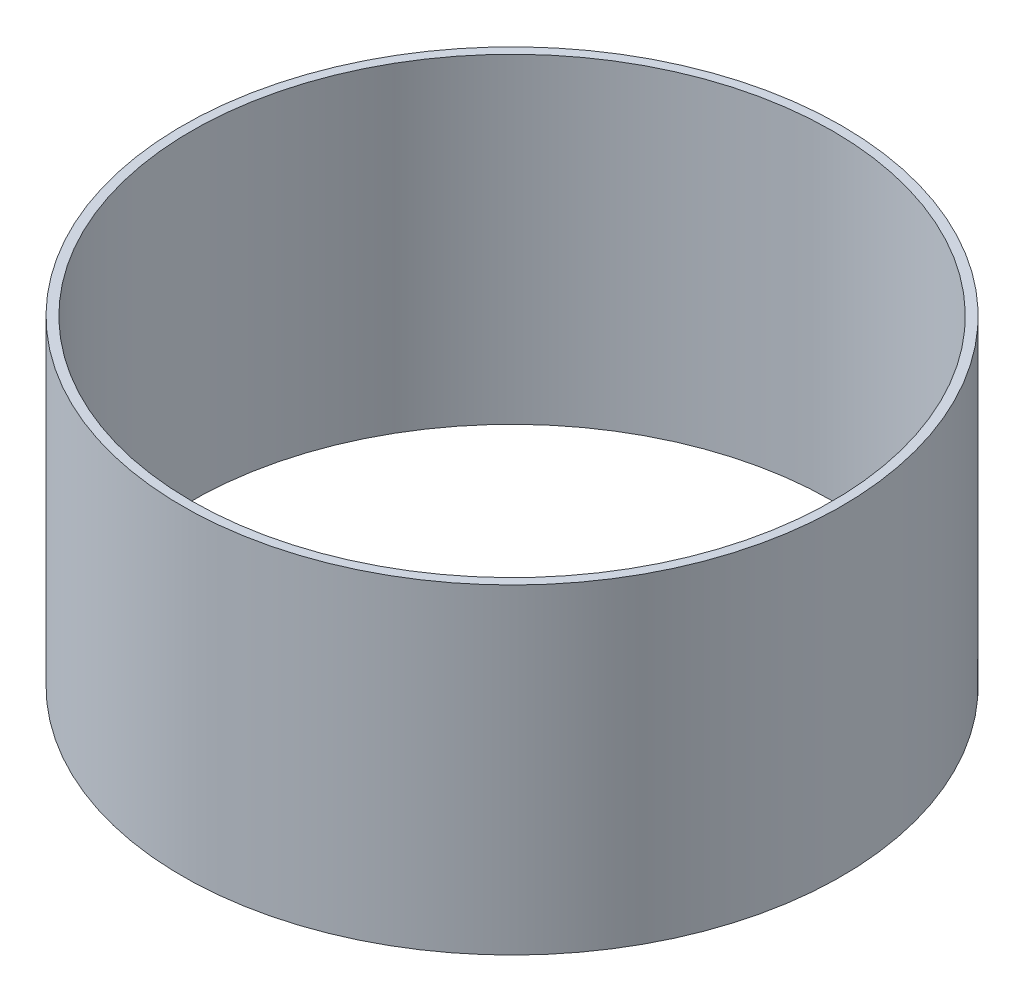
ISO-10303-21;
HEADER;
FILE_DESCRIPTION(('STEP AP214'),'2;1');
FILE_NAME('part.step','',(''),(''),'','','');
FILE_SCHEMA(('AUTOMOTIVE_DESIGN { 1 0 10303 214 1 1 1 1 }'));
ENDSEC;
DATA;
#1=APPLICATION_CONTEXT('core data for automotive mechanical design processes');
#2=APPLICATION_PROTOCOL_DEFINITION('international standard','automotive_design',2000,#1);
#3=PRODUCT_CONTEXT('',#1,'mechanical');
#4=PRODUCT('Part','Part','',(#3));
#5=PRODUCT_RELATED_PRODUCT_CATEGORY('part','',(#4));
#6=PRODUCT_DEFINITION_FORMATION('','',#4);
#7=PRODUCT_DEFINITION_CONTEXT('part definition',#1,'design');
#8=PRODUCT_DEFINITION('design','',#6,#7);
#9=PRODUCT_DEFINITION_SHAPE('','',#8);
#10=(LENGTH_UNIT() NAMED_UNIT(*) SI_UNIT(.MILLI.,.METRE.));
#11=(NAMED_UNIT(*) PLANE_ANGLE_UNIT() SI_UNIT($,.RADIAN.));
#12=(NAMED_UNIT(*) SI_UNIT($,.STERADIAN.) SOLID_ANGLE_UNIT());
#13=UNCERTAINTY_MEASURE_WITH_UNIT(LENGTH_MEASURE(1.E-05),#10,'distance_accuracy_value','');
#14=(GEOMETRIC_REPRESENTATION_CONTEXT(3) GLOBAL_UNCERTAINTY_ASSIGNED_CONTEXT((#13)) GLOBAL_UNIT_ASSIGNED_CONTEXT((#10,
#11,#12)) REPRESENTATION_CONTEXT('',''));
#15=CARTESIAN_POINT('',(0.,0.,0.));
#16=DIRECTION('',(0.,0.,1.));
#17=DIRECTION('',(1.,0.,0.));
#18=AXIS2_PLACEMENT_3D('',#15,#16,#17);
#19=CARTESIAN_POINT('',(0.,76.2,0.));
#20=DIRECTION('',(0.,1.,0.));
#21=DIRECTION('',(0.,0.,1.));
#22=AXIS2_PLACEMENT_3D('',#19,#20,#21);
#23=PLANE('',#22);
#24=CARTESIAN_POINT('',(0.,76.2,0.));
#25=DIRECTION('',(0.,1.,0.));
#26=DIRECTION('',(0.,0.,1.));
#27=AXIS2_PLACEMENT_3D('',#24,#25,#26);
#28=CIRCLE('',#27,78.359);
#29=CARTESIAN_POINT('',(0.,76.2,-78.359));
#30=VERTEX_POINT('',#29);
#31=EDGE_CURVE('E10',#30,#30,#28,.T.);
#32=ORIENTED_EDGE('',*,*,#31,.T.);
#33=EDGE_LOOP('',(#32));
#34=FACE_BOUND('',#33,.T.);
#35=CARTESIAN_POINT('',(0.,76.2,0.));
#36=DIRECTION('',(0.,1.,0.));
#37=DIRECTION('',(0.,0.,1.));
#38=AXIS2_PLACEMENT_3D('',#35,#36,#37);
#39=CIRCLE('',#38,76.2);
#40=CARTESIAN_POINT('',(0.,76.2,-76.2));
#41=VERTEX_POINT('',#40);
#42=EDGE_CURVE('E50',#41,#41,#39,.T.);
#43=ORIENTED_EDGE('',*,*,#42,.F.);
#44=EDGE_LOOP('',(#43));
#45=FACE_BOUND('',#44,.T.);
#46=ADVANCED_FACE('F37',(#34,#45),#23,.T.);
#47=CARTESIAN_POINT('',(0.,0.,0.));
#48=DIRECTION('',(0.,1.,0.));
#49=DIRECTION('',(0.,0.,1.));
#50=AXIS2_PLACEMENT_3D('',#47,#48,#49);
#51=PLANE('',#50);
#52=CARTESIAN_POINT('',(0.,0.,0.));
#53=DIRECTION('',(0.,1.,0.));
#54=DIRECTION('',(0.,0.,1.));
#55=AXIS2_PLACEMENT_3D('',#52,#53,#54);
#56=CIRCLE('',#55,78.359);
#57=CARTESIAN_POINT('',(0.,0.,-78.359));
#58=VERTEX_POINT('',#57);
#59=EDGE_CURVE('E41',#58,#58,#56,.T.);
#60=ORIENTED_EDGE('',*,*,#59,.F.);
#61=EDGE_LOOP('',(#60));
#62=FACE_BOUND('',#61,.T.);
#63=CARTESIAN_POINT('',(0.,0.,0.));
#64=DIRECTION('',(0.,1.,0.));
#65=DIRECTION('',(0.,0.,1.));
#66=AXIS2_PLACEMENT_3D('',#63,#64,#65);
#67=CIRCLE('',#66,76.2);
#68=CARTESIAN_POINT('',(0.,0.,-76.2));
#69=VERTEX_POINT('',#68);
#70=EDGE_CURVE('E52',#69,#69,#67,.T.);
#71=ORIENTED_EDGE('',*,*,#70,.T.);
#72=EDGE_LOOP('',(#71));
#73=FACE_BOUND('',#72,.T.);
#74=ADVANCED_FACE('F64',(#62,#73),#51,.F.);
#75=CARTESIAN_POINT('',(0.,76.2,0.));
#76=DIRECTION('',(0.,-1.,0.));
#77=DIRECTION('',(0.,0.,-1.));
#78=AXIS2_PLACEMENT_3D('',#75,#76,#77);
#79=CYLINDRICAL_SURFACE('',#78,78.359);
#80=CARTESIAN_POINT('',(0.,76.2,-78.359));
#81=CARTESIAN_POINT('',(0.,75.40625,-78.359));
#82=CARTESIAN_POINT('',(0.,74.6125,-78.359));
#83=CARTESIAN_POINT('',(0.,73.025,-78.359));
#84=CARTESIAN_POINT('',(0.,72.23125,-78.359));
#85=CARTESIAN_POINT('',(0.,70.64375,-78.359));
#86=CARTESIAN_POINT('',(0.,69.85,-78.359));
#87=CARTESIAN_POINT('',(0.,68.2625,-78.359));
#88=CARTESIAN_POINT('',(0.,67.46875,-78.359));
#89=CARTESIAN_POINT('',(0.,65.88125,-78.359));
#90=CARTESIAN_POINT('',(0.,65.0875,-78.359));
#91=CARTESIAN_POINT('',(0.,63.5,-78.359));
#92=CARTESIAN_POINT('',(0.,62.70625,-78.359));
#93=CARTESIAN_POINT('',(0.,61.11875,-78.359));
#94=CARTESIAN_POINT('',(0.,60.325,-78.359));
#95=CARTESIAN_POINT('',(0.,58.7375,-78.359));
#96=CARTESIAN_POINT('',(0.,57.94375,-78.359));
#97=CARTESIAN_POINT('',(0.,56.35625,-78.359));
#98=CARTESIAN_POINT('',(0.,55.5625,-78.359));
#99=CARTESIAN_POINT('',(0.,53.975,-78.359));
#100=CARTESIAN_POINT('',(0.,53.18125,-78.359));
#101=CARTESIAN_POINT('',(0.,51.59375,-78.359));
#102=CARTESIAN_POINT('',(0.,50.8,-78.359));
#103=CARTESIAN_POINT('',(0.,49.2125,-78.359));
#104=CARTESIAN_POINT('',(0.,48.41875,-78.359));
#105=CARTESIAN_POINT('',(0.,46.83125,-78.359));
#106=CARTESIAN_POINT('',(0.,46.0375,-78.359));
#107=CARTESIAN_POINT('',(0.,44.45,-78.359));
#108=CARTESIAN_POINT('',(0.,43.65625,-78.359));
#109=CARTESIAN_POINT('',(0.,42.06875,-78.359));
#110=CARTESIAN_POINT('',(0.,41.275,-78.359));
#111=CARTESIAN_POINT('',(0.,39.6875,-78.359));
#112=CARTESIAN_POINT('',(0.,38.89375,-78.359));
#113=CARTESIAN_POINT('',(0.,37.30625,-78.359));
#114=CARTESIAN_POINT('',(0.,36.5125,-78.359));
#115=CARTESIAN_POINT('',(0.,34.925,-78.359));
#116=CARTESIAN_POINT('',(0.,34.13125,-78.359));
#117=CARTESIAN_POINT('',(0.,32.54375,-78.359));
#118=CARTESIAN_POINT('',(0.,31.75,-78.359));
#119=CARTESIAN_POINT('',(0.,30.1625,-78.359));
#120=CARTESIAN_POINT('',(0.,29.36875,-78.359));
#121=CARTESIAN_POINT('',(0.,27.78125,-78.359));
#122=CARTESIAN_POINT('',(0.,26.9875,-78.359));
#123=CARTESIAN_POINT('',(0.,25.4,-78.359));
#124=CARTESIAN_POINT('',(0.,24.60625,-78.359));
#125=CARTESIAN_POINT('',(0.,23.01875,-78.359));
#126=CARTESIAN_POINT('',(0.,22.225,-78.359));
#127=CARTESIAN_POINT('',(0.,20.6375,-78.359));
#128=CARTESIAN_POINT('',(0.,19.84375,-78.359));
#129=CARTESIAN_POINT('',(0.,18.25625,-78.359));
#130=CARTESIAN_POINT('',(0.,17.4625,-78.359));
#131=CARTESIAN_POINT('',(0.,15.875,-78.359));
#132=CARTESIAN_POINT('',(0.,15.08125,-78.359));
#133=CARTESIAN_POINT('',(0.,13.49375,-78.359));
#134=CARTESIAN_POINT('',(0.,12.7,-78.359));
#135=CARTESIAN_POINT('',(0.,11.1125,-78.359));
#136=CARTESIAN_POINT('',(0.,10.31875,-78.359));
#137=CARTESIAN_POINT('',(0.,8.73125,-78.359));
#138=CARTESIAN_POINT('',(0.,7.93750000000001,-78.359));
#139=CARTESIAN_POINT('',(0.,6.35,-78.359));
#140=CARTESIAN_POINT('',(0.,5.55625,-78.359));
#141=CARTESIAN_POINT('',(0.,3.96875,-78.359));
#142=CARTESIAN_POINT('',(0.,3.175,-78.359));
#143=CARTESIAN_POINT('',(0.,1.5875,-78.359));
#144=CARTESIAN_POINT('',(0.,0.793750000000001,-78.359));
#145=CARTESIAN_POINT('',(0.,0.,-78.359));
#146=B_SPLINE_CURVE_WITH_KNOTS('',3,(#80,#81,#82,#83,#84,#85,#86,#87,#88,#89,#90,#91,#92,#93,
#94,#95,#96,#97,#98,#99,#100,#101,#102,#103,#104,#105,#106,#107,#108,#109,#110,#111,#112,#113,
#114,#115,#116,#117,#118,#119,#120,#121,#122,#123,#124,#125,#126,#127,#128,#129,#130,#131,#132,
#133,#134,#135,#136,#137,#138,#139,#140,#141,#142,#143,#144,#145),.UNSPECIFIED.,.F.,.F.,(4,2,2,
2,2,2,2,2,2,2,2,2,2,2,2,2,2,2,2,2,2,2,2,2,2,2,2,2,2,2,2,2,4),(0.,2.38125,4.7625,7.14375,
9.52500000000001,11.90625,14.2875,16.66875,19.05,21.43125,23.8125,26.19375,28.575,30.95625,
33.3375,35.71875,38.1,40.48125,42.8625,45.24375,47.625,50.00625,52.3875,54.76875,57.15,59.53125,
61.9125,64.29375,66.675,69.05625,71.4375,73.81875,76.2),.UNSPECIFIED.);
#147=EDGE_CURVE('BSEAM39',#30,#58,#146,.T.);
#148=ORIENTED_EDGE('',*,*,#31,.F.);
#149=ORIENTED_EDGE('',*,*,#59,.T.);
#150=ORIENTED_EDGE('',*,*,#147,.T.);
#151=ORIENTED_EDGE('',*,*,#147,.F.);
#152=EDGE_LOOP('',(#148,#150,#149,#151));
#153=FACE_BOUND('',#152,.T.);
#154=ADVANCED_FACE('F39',(#153),#79,.T.);
#155=CARTESIAN_POINT('',(0.,76.2,0.));
#156=DIRECTION('',(0.,-1.,0.));
#157=DIRECTION('',(0.,0.,-1.));
#158=AXIS2_PLACEMENT_3D('',#155,#156,#157);
#159=CYLINDRICAL_SURFACE('',#158,76.2);
#160=CARTESIAN_POINT('',(0.,76.2,-76.2));
#161=CARTESIAN_POINT('',(0.,75.40625,-76.2));
#162=CARTESIAN_POINT('',(0.,74.6125,-76.2));
#163=CARTESIAN_POINT('',(0.,73.025,-76.2));
#164=CARTESIAN_POINT('',(0.,72.23125,-76.2));
#165=CARTESIAN_POINT('',(0.,70.64375,-76.2));
#166=CARTESIAN_POINT('',(0.,69.85,-76.2));
#167=CARTESIAN_POINT('',(0.,68.2625,-76.2));
#168=CARTESIAN_POINT('',(0.,67.46875,-76.2));
#169=CARTESIAN_POINT('',(0.,65.88125,-76.2));
#170=CARTESIAN_POINT('',(0.,65.0875,-76.2));
#171=CARTESIAN_POINT('',(0.,63.5,-76.2));
#172=CARTESIAN_POINT('',(0.,62.70625,-76.2));
#173=CARTESIAN_POINT('',(0.,61.11875,-76.2));
#174=CARTESIAN_POINT('',(0.,60.325,-76.2));
#175=CARTESIAN_POINT('',(0.,58.7375,-76.2));
#176=CARTESIAN_POINT('',(0.,57.94375,-76.2));
#177=CARTESIAN_POINT('',(0.,56.35625,-76.2));
#178=CARTESIAN_POINT('',(0.,55.5625,-76.2));
#179=CARTESIAN_POINT('',(0.,53.975,-76.2));
#180=CARTESIAN_POINT('',(0.,53.18125,-76.2));
#181=CARTESIAN_POINT('',(0.,51.59375,-76.2));
#182=CARTESIAN_POINT('',(0.,50.8,-76.2));
#183=CARTESIAN_POINT('',(0.,49.2125,-76.2));
#184=CARTESIAN_POINT('',(0.,48.41875,-76.2));
#185=CARTESIAN_POINT('',(0.,46.83125,-76.2));
#186=CARTESIAN_POINT('',(0.,46.0375,-76.2));
#187=CARTESIAN_POINT('',(0.,44.45,-76.2));
#188=CARTESIAN_POINT('',(0.,43.65625,-76.2));
#189=CARTESIAN_POINT('',(0.,42.06875,-76.2));
#190=CARTESIAN_POINT('',(0.,41.275,-76.2));
#191=CARTESIAN_POINT('',(0.,39.6875,-76.2));
#192=CARTESIAN_POINT('',(0.,38.89375,-76.2));
#193=CARTESIAN_POINT('',(0.,37.30625,-76.2));
#194=CARTESIAN_POINT('',(0.,36.5125,-76.2));
#195=CARTESIAN_POINT('',(0.,34.925,-76.2));
#196=CARTESIAN_POINT('',(0.,34.13125,-76.2));
#197=CARTESIAN_POINT('',(0.,32.54375,-76.2));
#198=CARTESIAN_POINT('',(0.,31.75,-76.2));
#199=CARTESIAN_POINT('',(0.,30.1625,-76.2));
#200=CARTESIAN_POINT('',(0.,29.36875,-76.2));
#201=CARTESIAN_POINT('',(0.,27.78125,-76.2));
#202=CARTESIAN_POINT('',(0.,26.9875,-76.2));
#203=CARTESIAN_POINT('',(0.,25.4,-76.2));
#204=CARTESIAN_POINT('',(0.,24.60625,-76.2));
#205=CARTESIAN_POINT('',(0.,23.01875,-76.2));
#206=CARTESIAN_POINT('',(0.,22.225,-76.2));
#207=CARTESIAN_POINT('',(0.,20.6375,-76.2));
#208=CARTESIAN_POINT('',(0.,19.84375,-76.2));
#209=CARTESIAN_POINT('',(0.,18.25625,-76.2));
#210=CARTESIAN_POINT('',(0.,17.4625,-76.2));
#211=CARTESIAN_POINT('',(0.,15.875,-76.2));
#212=CARTESIAN_POINT('',(0.,15.08125,-76.2));
#213=CARTESIAN_POINT('',(0.,13.49375,-76.2));
#214=CARTESIAN_POINT('',(0.,12.7,-76.2));
#215=CARTESIAN_POINT('',(0.,11.1125,-76.2));
#216=CARTESIAN_POINT('',(0.,10.31875,-76.2));
#217=CARTESIAN_POINT('',(0.,8.73125,-76.2));
#218=CARTESIAN_POINT('',(0.,7.93750000000001,-76.2));
#219=CARTESIAN_POINT('',(0.,6.35,-76.2));
#220=CARTESIAN_POINT('',(0.,5.55625,-76.2));
#221=CARTESIAN_POINT('',(0.,3.96875,-76.2));
#222=CARTESIAN_POINT('',(0.,3.175,-76.2));
#223=CARTESIAN_POINT('',(0.,1.5875,-76.2));
#224=CARTESIAN_POINT('',(0.,0.793750000000001,-76.2));
#225=CARTESIAN_POINT('',(0.,0.,-76.2));
#226=B_SPLINE_CURVE_WITH_KNOTS('',3,(#160,#161,#162,#163,#164,#165,#166,#167,#168,#169,#170,
#171,#172,#173,#174,#175,#176,#177,#178,#179,#180,#181,#182,#183,#184,#185,#186,#187,#188,#189,
#190,#191,#192,#193,#194,#195,#196,#197,#198,#199,#200,#201,#202,#203,#204,#205,#206,#207,#208,
#209,#210,#211,#212,#213,#214,#215,#216,#217,#218,#219,#220,#221,#222,#223,#224,#225),
.UNSPECIFIED.,.F.,.F.,(4,2,2,2,2,2,2,2,2,2,2,2,2,2,2,2,2,2,2,2,2,2,2,2,2,2,2,2,2,2,2,2,4),(0.,
2.38125,4.7625,7.14375,9.52500000000001,11.90625,14.2875,16.66875,19.05,21.43125,23.8125,
26.19375,28.575,30.95625,33.3375,35.71875,38.1,40.48125,42.8625,45.24375,47.625,50.00625,
52.3875,54.76875,57.15,59.53125,61.9125,64.29375,66.675,69.05625,71.4375,73.81875,76.2),.UNSPECIFIED.);
#227=EDGE_CURVE('BSEAM60',#41,#69,#226,.T.);
#228=ORIENTED_EDGE('',*,*,#42,.T.);
#229=ORIENTED_EDGE('',*,*,#70,.F.);
#230=ORIENTED_EDGE('',*,*,#227,.T.);
#231=ORIENTED_EDGE('',*,*,#227,.F.);
#232=EDGE_LOOP('',(#228,#230,#229,#231));
#233=FACE_BOUND('',#232,.T.);
#234=ADVANCED_FACE('F60',(#233),#159,.F.);
#235=CLOSED_SHELL('',(#46,#74,#154,#234));
#236=MANIFOLD_SOLID_BREP('B2',#235);
#237=ADVANCED_BREP_SHAPE_REPRESENTATION('',(#18,#236),#14);
#238=SHAPE_DEFINITION_REPRESENTATION(#9,#237);
ENDSEC;
END-ISO-10303-21;
